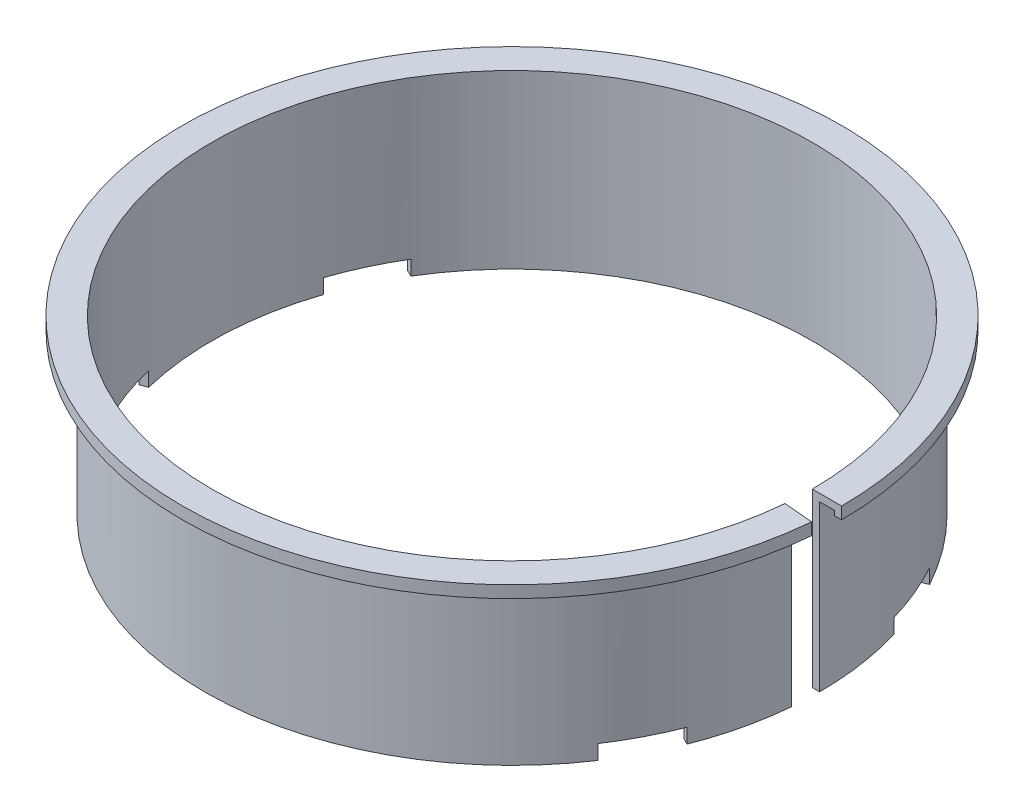
ISO-10303-21;
HEADER;
FILE_DESCRIPTION(('STEP AP214'),'2;1');
FILE_NAME('part.step','',(''),(''),'','','');
FILE_SCHEMA(('AUTOMOTIVE_DESIGN { 1 0 10303 214 1 1 1 1 }'));
ENDSEC;
DATA;
#1=APPLICATION_CONTEXT('core data for automotive mechanical design processes');
#2=APPLICATION_PROTOCOL_DEFINITION('international standard','automotive_design',2000,#1);
#3=PRODUCT_CONTEXT('',#1,'mechanical');
#4=PRODUCT('Part','Part','',(#3));
#5=PRODUCT_RELATED_PRODUCT_CATEGORY('part','',(#4));
#6=PRODUCT_DEFINITION_FORMATION('','',#4);
#7=PRODUCT_DEFINITION_CONTEXT('part definition',#1,'design');
#8=PRODUCT_DEFINITION('design','',#6,#7);
#9=PRODUCT_DEFINITION_SHAPE('','',#8);
#10=(LENGTH_UNIT() NAMED_UNIT(*) SI_UNIT(.MILLI.,.METRE.));
#11=(NAMED_UNIT(*) PLANE_ANGLE_UNIT() SI_UNIT($,.RADIAN.));
#12=(NAMED_UNIT(*) SI_UNIT($,.STERADIAN.) SOLID_ANGLE_UNIT());
#13=UNCERTAINTY_MEASURE_WITH_UNIT(LENGTH_MEASURE(1.E-05),#10,'distance_accuracy_value','');
#14=(GEOMETRIC_REPRESENTATION_CONTEXT(3) GLOBAL_UNCERTAINTY_ASSIGNED_CONTEXT((#13)) GLOBAL_UNIT_ASSIGNED_CONTEXT((#10,
#11,#12)) REPRESENTATION_CONTEXT('',''));
#15=CARTESIAN_POINT('',(0.,0.,0.));
#16=DIRECTION('',(0.,0.,1.));
#17=DIRECTION('',(1.,0.,0.));
#18=AXIS2_PLACEMENT_3D('',#15,#16,#17);
#19=CARTESIAN_POINT('',(0.,27.5,0.));
#20=DIRECTION('',(0.,-1.,0.));
#21=DIRECTION('',(0.,0.,-1.));
#22=AXIS2_PLACEMENT_3D('',#19,#20,#21);
#23=PLANE('',#22);
#24=DIRECTION('',(1.,0.,0.));
#25=VECTOR('',#24,1.);
#26=CARTESIAN_POINT('',(0.,27.5,0.));
#27=LINE('',#26,#25);
#28=CARTESIAN_POINT('',(102.5,27.5,0.));
#29=VERTEX_POINT('',#28);
#30=CARTESIAN_POINT('',(105.,27.5,0.));
#31=VERTEX_POINT('',#30);
#32=EDGE_CURVE('E322',#29,#31,#27,.T.);
#33=ORIENTED_EDGE('',*,*,#32,.F.);
#34=CARTESIAN_POINT('',(0.,27.5,0.));
#35=DIRECTION('',(0.,-1.,0.));
#36=DIRECTION('',(0.,0.,-1.));
#37=AXIS2_PLACEMENT_3D('',#34,#35,#36);
#38=CIRCLE('',#37,102.5);
#39=CARTESIAN_POINT('',(98.3719399413447,27.5,-28.7960315352042));
#40=VERTEX_POINT('',#39);
#41=EDGE_CURVE('E329',#29,#40,#38,.F.);
#42=ORIENTED_EDGE('',*,*,#41,.T.);
#43=DIRECTION('',(-0.923093568144189,0.,0.384575434018905));
#44=VECTOR('',#43,1.);
#45=CARTESIAN_POINT('',(89.261262530645,27.5,-25.0003786996309));
#46=LINE('',#45,#44);
#47=CARTESIAN_POINT('',(100.693363737791,27.5,-29.7631735399469));
#48=VERTEX_POINT('',#47);
#49=EDGE_CURVE('E318',#48,#40,#46,.T.);
#50=ORIENTED_EDGE('',*,*,#49,.F.);
#51=CARTESIAN_POINT('',(0.,27.5,0.));
#52=DIRECTION('',(0.,-1.,0.));
#53=DIRECTION('',(0.,0.,-1.));
#54=AXIS2_PLACEMENT_3D('',#51,#52,#53);
#55=CIRCLE('',#54,105.);
#56=EDGE_CURVE('E352',#31,#48,#55,.F.);
#57=ORIENTED_EDGE('',*,*,#56,.F.);
#58=EDGE_LOOP('',(#33,#42,#50,#57));
#59=FACE_BOUND('',#58,.T.);
#60=ADVANCED_FACE('F42',(#59),#23,.T.);
#61=CARTESIAN_POINT('',(89.7189926759193,27.5,-49.5656368184485));
#62=VERTEX_POINT('',#61);
#63=CARTESIAN_POINT('',(-87.6470877946232,27.5,-53.1435602977596));
#64=VERTEX_POINT('',#63);
#65=EDGE_CURVE('E326',#62,#64,#38,.F.);
#66=ORIENTED_EDGE('',*,*,#65,.T.);
#67=DIRECTION('',(-0.906833191041583,0.,-0.421489695752269));
#68=VECTOR('',#67,1.);
#69=CARTESIAN_POINT('',(-78.6968957945803,27.5,-48.9835739405228));
#70=LINE('',#69,#68);
#71=CARTESIAN_POINT('',(-89.9276194999011,27.5,-54.2035354112719));
#72=VERTEX_POINT('',#71);
#73=EDGE_CURVE('E330',#64,#72,#70,.T.);
#74=ORIENTED_EDGE('',*,*,#73,.T.);
#75=CARTESIAN_POINT('',(92.0404164723653,27.5,-50.5327788231911));
#76=VERTEX_POINT('',#75);
#77=EDGE_CURVE('E323',#76,#72,#55,.F.);
#78=ORIENTED_EDGE('',*,*,#77,.F.);
#79=DIRECTION('',(-0.923093568144189,0.,0.384575434018905));
#80=VECTOR('',#79,1.);
#81=CARTESIAN_POINT('',(80.6083152652197,27.5,-45.7699839828751));
#82=LINE('',#81,#80);
#83=EDGE_CURVE('E333',#76,#62,#82,.T.);
#84=ORIENTED_EDGE('',*,*,#83,.T.);
#85=EDGE_LOOP('',(#66,#74,#78,#84));
#86=FACE_BOUND('',#85,.T.);
#87=ADVANCED_FACE('F365',(#86),#23,.T.);
#88=CARTESIAN_POINT('',(95.6100685272702,27.5,36.9454299773421));
#89=VERTEX_POINT('',#88);
#90=CARTESIAN_POINT('',(102.109956554404,27.5,8.93346363163362));
#91=VERTEX_POINT('',#90);
#92=EDGE_CURVE('E343',#89,#91,#38,.F.);
#93=ORIENTED_EDGE('',*,*,#92,.T.);
#94=DIRECTION('',(0.996194698091747,0.,0.087155742747645));
#95=VECTOR('',#94,1.);
#96=CARTESIAN_POINT('',(0.,27.5,0.));
#97=LINE('',#96,#95);
#98=CARTESIAN_POINT('',(104.600443299633,27.5,9.15135298850273));
#99=VERTEX_POINT('',#98);
#100=EDGE_CURVE('E227',#91,#99,#97,.T.);
#101=ORIENTED_EDGE('',*,*,#100,.T.);
#102=CARTESIAN_POINT('',(97.8421942066153,27.5,38.103871625269));
#103=VERTEX_POINT('',#102);
#104=EDGE_CURVE('E220',#103,#99,#55,.F.);
#105=ORIENTED_EDGE('',*,*,#104,.F.);
#106=DIRECTION('',(0.887584964471982,0.,0.460644039192163));
#107=VECTOR('',#106,1.);
#108=CARTESIAN_POINT('',(86.849851183162,27.5,32.399001113496));
#109=LINE('',#108,#107);
#110=EDGE_CURVE('E316',#89,#103,#109,.T.);
#111=ORIENTED_EDGE('',*,*,#110,.F.);
#112=EDGE_LOOP('',(#93,#101,#105,#111));
#113=FACE_BOUND('',#112,.T.);
#114=ADVANCED_FACE('F340',(#113),#23,.T.);
#115=DIRECTION('',(-0.906833191041583,0.,-0.421489695752269));
#116=VECTOR('',#115,1.);
#117=CARTESIAN_POINT('',(-88.1804139490064,27.5,-28.5798271420872));
#118=LINE('',#117,#116);
#119=CARTESIAN_POINT('',(-97.1306059490493,27.5,-32.739813499324));
#120=VERTEX_POINT('',#119);
#121=CARTESIAN_POINT('',(-99.4111376543272,27.5,-33.7997886128363));
#122=VERTEX_POINT('',#121);
#123=EDGE_CURVE('E320',#120,#122,#118,.T.);
#124=ORIENTED_EDGE('',*,*,#123,.F.);
#125=CARTESIAN_POINT('',(-99.5343769060761,27.5,24.4777003396805));
#126=VERTEX_POINT('',#125);
#127=EDGE_CURVE('E325',#120,#126,#38,.F.);
#128=ORIENTED_EDGE('',*,*,#127,.T.);
#129=DIRECTION('',(0.938989932435764,0.,-0.343944627497333));
#130=VECTOR('',#129,1.);
#131=CARTESIAN_POINT('',(-90.2668067901714,27.5,21.0830622916966));
#132=LINE('',#131,#130);
#133=CARTESIAN_POINT('',(-101.895777363195,27.5,25.3426627557195));
#134=VERTEX_POINT('',#133);
#135=EDGE_CURVE('E234',#134,#126,#132,.T.);
#136=ORIENTED_EDGE('',*,*,#135,.F.);
#137=EDGE_CURVE('E221',#122,#134,#55,.F.);
#138=ORIENTED_EDGE('',*,*,#137,.F.);
#139=EDGE_LOOP('',(#124,#128,#136,#138));
#140=FACE_BOUND('',#139,.T.);
#141=ADVANCED_FACE('F474',(#140),#23,.T.);
#142=CARTESIAN_POINT('',(-91.7956227873861,27.5,45.6049738194851));
#143=VERTEX_POINT('',#142);
#144=CARTESIAN_POINT('',(85.2455776454466,27.5,56.9160916779617));
#145=VERTEX_POINT('',#144);
#146=EDGE_CURVE('E399',#143,#145,#38,.F.);
#147=ORIENTED_EDGE('',*,*,#146,.T.);
#148=DIRECTION('',(0.887584964471982,0.,0.460644039192163));
#149=VECTOR('',#148,1.);
#150=CARTESIAN_POINT('',(76.4853603013383,27.5,52.3696628141156));
#151=LINE('',#150,#149);
#152=CARTESIAN_POINT('',(87.4777033247916,27.5,58.0745333258886));
#153=VERTEX_POINT('',#152);
#154=EDGE_CURVE('E219',#145,#153,#151,.T.);
#155=ORIENTED_EDGE('',*,*,#154,.T.);
#156=CARTESIAN_POINT('',(-94.1570232445054,27.5,46.4699362355241));
#157=VERTEX_POINT('',#156);
#158=EDGE_CURVE('E209',#157,#153,#55,.F.);
#159=ORIENTED_EDGE('',*,*,#158,.F.);
#160=DIRECTION('',(0.938989932435764,0.,-0.343944627497333));
#161=VECTOR('',#160,1.);
#162=CARTESIAN_POINT('',(-82.5280526714814,27.5,42.2103357715013));
#163=LINE('',#162,#161);
#164=EDGE_CURVE('E217',#157,#143,#163,.T.);
#165=ORIENTED_EDGE('',*,*,#164,.T.);
#166=EDGE_LOOP('',(#147,#155,#159,#165));
#167=FACE_BOUND('',#166,.T.);
#168=ADVANCED_FACE('F216',(#167),#23,.T.);
#169=CARTESIAN_POINT('',(0.,82.2536172695449,0.));
#170=DIRECTION('',(0.,-1.,0.));
#171=DIRECTION('',(0.,0.,-1.));
#172=AXIS2_PLACEMENT_3D('',#169,#170,#171);
#173=CYLINDRICAL_SURFACE('',#172,105.);
#174=DIRECTION('',(0.,-1.,0.));
#175=VECTOR('',#174,1.);
#176=CARTESIAN_POINT('',(-99.4111376543272,82.2536172695449,-33.7997886128363));
#177=LINE('',#176,#175);
#178=CARTESIAN_POINT('',(-99.4111376543272,32.5,-33.7997886128363));
#179=VERTEX_POINT('',#178);
#180=EDGE_CURVE('E261',#179,#122,#177,.T.);
#181=ORIENTED_EDGE('',*,*,#180,.T.);
#182=ORIENTED_EDGE('',*,*,#137,.T.);
#183=DIRECTION('',(0.,-1.,0.));
#184=VECTOR('',#183,1.);
#185=CARTESIAN_POINT('',(-101.895777363195,82.2536172695449,25.3426627557195));
#186=LINE('',#185,#184);
#187=CARTESIAN_POINT('',(-101.895777363195,32.5,25.3426627557195));
#188=VERTEX_POINT('',#187);
#189=EDGE_CURVE('E300',#134,#188,#186,.F.);
#190=ORIENTED_EDGE('',*,*,#189,.T.);
#191=CARTESIAN_POINT('',(0.,32.5,0.));
#192=DIRECTION('',(0.,1.,0.));
#193=DIRECTION('',(0.0436193873653294,0.,-0.999048221581858));
#194=AXIS2_PLACEMENT_3D('',#191,#192,#193);
#195=CIRCLE('',#194,105.);
#196=CARTESIAN_POINT('',(-94.1570232445054,32.5,46.4699362355241));
#197=VERTEX_POINT('',#196);
#198=EDGE_CURVE('E212',#197,#188,#195,.F.);
#199=ORIENTED_EDGE('',*,*,#198,.F.);
#200=DIRECTION('',(0.,-1.,0.));
#201=VECTOR('',#200,1.);
#202=CARTESIAN_POINT('',(-94.1570232445054,82.2536172695449,46.4699362355241));
#203=LINE('',#202,#201);
#204=EDGE_CURVE('E46',#157,#197,#203,.F.);
#205=ORIENTED_EDGE('',*,*,#204,.F.);
#206=ORIENTED_EDGE('',*,*,#158,.T.);
#207=DIRECTION('',(0.,-1.,0.));
#208=VECTOR('',#207,1.);
#209=CARTESIAN_POINT('',(87.4777033247916,82.2536172695449,58.0745333258886));
#210=LINE('',#209,#208);
#211=CARTESIAN_POINT('',(87.4777033247916,32.5,58.0745333258886));
#212=VERTEX_POINT('',#211);
#213=EDGE_CURVE('E290',#212,#153,#210,.T.);
#214=ORIENTED_EDGE('',*,*,#213,.F.);
#215=CARTESIAN_POINT('',(0.,32.5,0.));
#216=DIRECTION('',(0.,1.,0.));
#217=DIRECTION('',(0.0436193873653294,0.,-0.999048221581858));
#218=AXIS2_PLACEMENT_3D('',#215,#216,#217);
#219=CIRCLE('',#218,105.);
#220=CARTESIAN_POINT('',(97.8421942066153,32.5,38.103871625269));
#221=VERTEX_POINT('',#220);
#222=EDGE_CURVE('E296',#221,#212,#219,.F.);
#223=ORIENTED_EDGE('',*,*,#222,.F.);
#224=DIRECTION('',(0.,-1.,0.));
#225=VECTOR('',#224,1.);
#226=CARTESIAN_POINT('',(97.8421942066153,82.2536172695449,38.103871625269));
#227=LINE('',#226,#225);
#228=EDGE_CURVE('E297',#221,#103,#227,.T.);
#229=ORIENTED_EDGE('',*,*,#228,.T.);
#230=ORIENTED_EDGE('',*,*,#104,.T.);
#231=DIRECTION('',(0.,1.,0.));
#232=VECTOR('',#231,1.);
#233=CARTESIAN_POINT('',(104.600443299633,0.,9.15135298850273));
#234=LINE('',#233,#232);
#235=CARTESIAN_POINT('',(104.600443299633,83.7,9.15135298850273));
#236=VERTEX_POINT('',#235);
#237=EDGE_CURVE('E288',#99,#236,#234,.T.);
#238=ORIENTED_EDGE('',*,*,#237,.T.);
#239=CARTESIAN_POINT('',(0.,83.7,0.));
#240=DIRECTION('',(0.,-1.,0.));
#241=DIRECTION('',(0.,0.,-1.));
#242=AXIS2_PLACEMENT_3D('',#239,#240,#241);
#243=CIRCLE('',#242,105.);
#244=CARTESIAN_POINT('',(105.,83.7,0.));
#245=VERTEX_POINT('',#244);
#246=EDGE_CURVE('E243',#236,#245,#243,.T.);
#247=ORIENTED_EDGE('',*,*,#246,.T.);
#248=DIRECTION('',(0.,1.,0.));
#249=VECTOR('',#248,1.);
#250=CARTESIAN_POINT('',(105.,0.,0.));
#251=LINE('',#250,#249);
#252=EDGE_CURVE('E252',#31,#245,#251,.T.);
#253=ORIENTED_EDGE('',*,*,#252,.F.);
#254=ORIENTED_EDGE('',*,*,#56,.T.);
#255=DIRECTION('',(0.,-1.,0.));
#256=VECTOR('',#255,1.);
#257=CARTESIAN_POINT('',(100.693363737791,82.2536172695449,-29.7631735399469));
#258=LINE('',#257,#256);
#259=CARTESIAN_POINT('',(100.693363737791,32.5,-29.7631735399469));
#260=VERTEX_POINT('',#259);
#261=EDGE_CURVE('E264',#48,#260,#258,.F.);
#262=ORIENTED_EDGE('',*,*,#261,.T.);
#263=CARTESIAN_POINT('',(0.,32.5,0.));
#264=DIRECTION('',(0.,1.,0.));
#265=DIRECTION('',(0.,0.,1.));
#266=AXIS2_PLACEMENT_3D('',#263,#264,#265);
#267=CIRCLE('',#266,105.);
#268=CARTESIAN_POINT('',(92.0404164723653,32.5,-50.5327788231911));
#269=VERTEX_POINT('',#268);
#270=EDGE_CURVE('E266',#269,#260,#267,.F.);
#271=ORIENTED_EDGE('',*,*,#270,.F.);
#272=DIRECTION('',(0.,-1.,0.));
#273=VECTOR('',#272,1.);
#274=CARTESIAN_POINT('',(92.0404164723653,82.2536172695449,-50.5327788231911));
#275=LINE('',#274,#273);
#276=EDGE_CURVE('E268',#76,#269,#275,.F.);
#277=ORIENTED_EDGE('',*,*,#276,.F.);
#278=ORIENTED_EDGE('',*,*,#77,.T.);
#279=DIRECTION('',(0.,-1.,0.));
#280=VECTOR('',#279,1.);
#281=CARTESIAN_POINT('',(-89.9276194999011,82.2536172695449,-54.2035354112719));
#282=LINE('',#281,#280);
#283=CARTESIAN_POINT('',(-89.9276194999011,32.5,-54.2035354112719));
#284=VERTEX_POINT('',#283);
#285=EDGE_CURVE('E254',#284,#72,#282,.T.);
#286=ORIENTED_EDGE('',*,*,#285,.F.);
#287=CARTESIAN_POINT('',(0.,32.5,0.));
#288=DIRECTION('',(0.,1.,0.));
#289=DIRECTION('',(0.,0.,1.));
#290=AXIS2_PLACEMENT_3D('',#287,#288,#289);
#291=CIRCLE('',#290,105.);
#292=EDGE_CURVE('E260',#179,#284,#291,.F.);
#293=ORIENTED_EDGE('',*,*,#292,.F.);
#294=EDGE_LOOP('',(#181,#182,#190,#199,#205,#206,#214,#223,#229,#230,#238,#247,#253,#254,#262,
#271,#277,#278,#286,#293));
#295=FACE_BOUND('',#294,.T.);
#296=ADVANCED_FACE('F207',(#295),#173,.T.);
#297=CARTESIAN_POINT('',(0.,82.2536172695449,0.));
#298=DIRECTION('',(0.,-1.,0.));
#299=DIRECTION('',(0.,0.,-1.));
#300=AXIS2_PLACEMENT_3D('',#297,#298,#299);
#301=CYLINDRICAL_SURFACE('',#300,102.5);
#302=ORIENTED_EDGE('',*,*,#127,.F.);
#303=DIRECTION('',(0.,-1.,0.));
#304=VECTOR('',#303,1.);
#305=CARTESIAN_POINT('',(-97.1306059490493,82.2536172695449,-32.739813499324));
#306=LINE('',#305,#304);
#307=CARTESIAN_POINT('',(-97.1306059490492,32.5,-32.739813499324));
#308=VERTEX_POINT('',#307);
#309=EDGE_CURVE('E240',#308,#120,#306,.T.);
#310=ORIENTED_EDGE('',*,*,#309,.F.);
#311=CARTESIAN_POINT('',(0.,32.5,0.));
#312=DIRECTION('',(0.,1.,0.));
#313=DIRECTION('',(0.,0.,1.));
#314=AXIS2_PLACEMENT_3D('',#311,#312,#313);
#315=CIRCLE('',#314,102.5);
#316=CARTESIAN_POINT('',(-87.6470877946232,32.5,-53.1435602977596));
#317=VERTEX_POINT('',#316);
#318=EDGE_CURVE('E239',#308,#317,#315,.F.);
#319=ORIENTED_EDGE('',*,*,#318,.T.);
#320=DIRECTION('',(0.,-1.,0.));
#321=VECTOR('',#320,1.);
#322=CARTESIAN_POINT('',(-87.6470877946232,82.2536172695449,-53.1435602977596));
#323=LINE('',#322,#321);
#324=EDGE_CURVE('E237',#317,#64,#323,.T.);
#325=ORIENTED_EDGE('',*,*,#324,.T.);
#326=ORIENTED_EDGE('',*,*,#65,.F.);
#327=DIRECTION('',(0.,-1.,0.));
#328=VECTOR('',#327,1.);
#329=CARTESIAN_POINT('',(89.7189926759193,82.2536172695449,-49.5656368184485));
#330=LINE('',#329,#328);
#331=CARTESIAN_POINT('',(89.7189926759193,32.5,-49.5656368184485));
#332=VERTEX_POINT('',#331);
#333=EDGE_CURVE('E235',#62,#332,#330,.F.);
#334=ORIENTED_EDGE('',*,*,#333,.T.);
#335=CARTESIAN_POINT('',(0.,32.5,0.));
#336=DIRECTION('',(0.,1.,0.));
#337=DIRECTION('',(0.,0.,1.));
#338=AXIS2_PLACEMENT_3D('',#335,#336,#337);
#339=CIRCLE('',#338,102.5);
#340=CARTESIAN_POINT('',(98.3719399413447,32.5,-28.7960315352042));
#341=VERTEX_POINT('',#340);
#342=EDGE_CURVE('E233',#332,#341,#339,.F.);
#343=ORIENTED_EDGE('',*,*,#342,.T.);
#344=DIRECTION('',(0.,-1.,0.));
#345=VECTOR('',#344,1.);
#346=CARTESIAN_POINT('',(98.3719399413447,82.2536172695449,-28.7960315352042));
#347=LINE('',#346,#345);
#348=EDGE_CURVE('E231',#40,#341,#347,.F.);
#349=ORIENTED_EDGE('',*,*,#348,.F.);
#350=ORIENTED_EDGE('',*,*,#41,.F.);
#351=DIRECTION('',(0.,1.,0.));
#352=VECTOR('',#351,1.);
#353=CARTESIAN_POINT('',(102.5,0.,0.));
#354=LINE('',#353,#352);
#355=CARTESIAN_POINT('',(102.5,86.2,0.));
#356=VERTEX_POINT('',#355);
#357=EDGE_CURVE('E249',#29,#356,#354,.T.);
#358=ORIENTED_EDGE('',*,*,#357,.T.);
#359=CARTESIAN_POINT('',(0.,86.2,0.));
#360=DIRECTION('',(0.,-1.,0.));
#361=DIRECTION('',(0.,0.,-1.));
#362=AXIS2_PLACEMENT_3D('',#359,#360,#361);
#363=CIRCLE('',#362,102.5);
#364=CARTESIAN_POINT('',(102.109956554404,86.2,8.93346363163362));
#365=VERTEX_POINT('',#364);
#366=EDGE_CURVE('E251',#365,#356,#363,.T.);
#367=ORIENTED_EDGE('',*,*,#366,.F.);
#368=DIRECTION('',(0.,1.,0.));
#369=VECTOR('',#368,1.);
#370=CARTESIAN_POINT('',(102.109956554404,0.,8.93346363163362));
#371=LINE('',#370,#369);
#372=EDGE_CURVE('E281',#91,#365,#371,.T.);
#373=ORIENTED_EDGE('',*,*,#372,.F.);
#374=ORIENTED_EDGE('',*,*,#92,.F.);
#375=DIRECTION('',(0.,-1.,0.));
#376=VECTOR('',#375,1.);
#377=CARTESIAN_POINT('',(95.6100685272702,82.2536172695449,36.9454299773421));
#378=LINE('',#377,#376);
#379=CARTESIAN_POINT('',(95.6100685272702,32.5,36.9454299773421));
#380=VERTEX_POINT('',#379);
#381=EDGE_CURVE('E278',#380,#89,#378,.T.);
#382=ORIENTED_EDGE('',*,*,#381,.F.);
#383=CARTESIAN_POINT('',(0.,32.5,0.));
#384=DIRECTION('',(0.,1.,0.));
#385=DIRECTION('',(0.0436193873653294,0.,-0.999048221581858));
#386=AXIS2_PLACEMENT_3D('',#383,#384,#385);
#387=CIRCLE('',#386,102.5);
#388=CARTESIAN_POINT('',(85.2455776454466,32.5,56.9160916779617));
#389=VERTEX_POINT('',#388);
#390=EDGE_CURVE('E277',#380,#389,#387,.F.);
#391=ORIENTED_EDGE('',*,*,#390,.T.);
#392=DIRECTION('',(0.,-1.,0.));
#393=VECTOR('',#392,1.);
#394=CARTESIAN_POINT('',(85.2455776454466,82.2536172695449,56.9160916779617));
#395=LINE('',#394,#393);
#396=EDGE_CURVE('E275',#389,#145,#395,.T.);
#397=ORIENTED_EDGE('',*,*,#396,.T.);
#398=ORIENTED_EDGE('',*,*,#146,.F.);
#399=DIRECTION('',(0.,-1.,0.));
#400=VECTOR('',#399,1.);
#401=CARTESIAN_POINT('',(-91.7956227873861,82.2536172695449,45.6049738194851));
#402=LINE('',#401,#400);
#403=CARTESIAN_POINT('',(-91.7956227873861,32.5,45.6049738194851));
#404=VERTEX_POINT('',#403);
#405=EDGE_CURVE('E224',#143,#404,#402,.F.);
#406=ORIENTED_EDGE('',*,*,#405,.T.);
#407=CARTESIAN_POINT('',(0.,32.5,0.));
#408=DIRECTION('',(0.,1.,0.));
#409=DIRECTION('',(0.0436193873653294,0.,-0.999048221581858));
#410=AXIS2_PLACEMENT_3D('',#407,#408,#409);
#411=CIRCLE('',#410,102.5);
#412=CARTESIAN_POINT('',(-99.5343769060761,32.5,24.4777003396805));
#413=VERTEX_POINT('',#412);
#414=EDGE_CURVE('E272',#404,#413,#411,.F.);
#415=ORIENTED_EDGE('',*,*,#414,.T.);
#416=DIRECTION('',(0.,-1.,0.));
#417=VECTOR('',#416,1.);
#418=CARTESIAN_POINT('',(-99.5343769060761,82.2536172695449,24.4777003396805));
#419=LINE('',#418,#417);
#420=EDGE_CURVE('E65',#126,#413,#419,.F.);
#421=ORIENTED_EDGE('',*,*,#420,.F.);
#422=EDGE_LOOP('',(#302,#310,#319,#325,#326,#334,#343,#349,#350,#358,#367,#373,#374,#382,#391,
#397,#398,#406,#415,#421));
#423=FACE_BOUND('',#422,.T.);
#424=ADVANCED_FACE('F398',(#423),#301,.F.);
#425=CARTESIAN_POINT('',(0.,0.,0.));
#426=DIRECTION('',(0.,0.,1.));
#427=DIRECTION('',(1.,0.,0.));
#428=AXIS2_PLACEMENT_3D('',#425,#426,#427);
#429=PLANE('',#428);
#430=ORIENTED_EDGE('',*,*,#357,.F.);
#431=ORIENTED_EDGE('',*,*,#32,.T.);
#432=ORIENTED_EDGE('',*,*,#252,.T.);
#433=DIRECTION('',(1.,0.,0.));
#434=VECTOR('',#433,1.);
#435=CARTESIAN_POINT('',(0.,83.7,0.));
#436=LINE('',#435,#434);
#437=CARTESIAN_POINT('',(110.,83.7,0.));
#438=VERTEX_POINT('',#437);
#439=EDGE_CURVE('E255',#245,#438,#436,.T.);
#440=ORIENTED_EDGE('',*,*,#439,.T.);
#441=DIRECTION('',(0.,1.,0.));
#442=VECTOR('',#441,1.);
#443=CARTESIAN_POINT('',(110.,0.,0.));
#444=LINE('',#443,#442);
#445=CARTESIAN_POINT('',(110.,82.1,0.));
#446=VERTEX_POINT('',#445);
#447=EDGE_CURVE('E256',#446,#438,#444,.T.);
#448=ORIENTED_EDGE('',*,*,#447,.F.);
#449=DIRECTION('',(1.,0.,0.));
#450=VECTOR('',#449,1.);
#451=CARTESIAN_POINT('',(0.,82.1,0.));
#452=LINE('',#451,#450);
#453=CARTESIAN_POINT('',(112.5,82.1,0.));
#454=VERTEX_POINT('',#453);
#455=EDGE_CURVE('E247',#446,#454,#452,.T.);
#456=ORIENTED_EDGE('',*,*,#455,.T.);
#457=DIRECTION('',(0.,1.,0.));
#458=VECTOR('',#457,1.);
#459=CARTESIAN_POINT('',(112.5,0.,0.));
#460=LINE('',#459,#458);
#461=CARTESIAN_POINT('',(112.5,86.2,0.));
#462=VERTEX_POINT('',#461);
#463=EDGE_CURVE('E244',#454,#462,#460,.T.);
#464=ORIENTED_EDGE('',*,*,#463,.T.);
#465=DIRECTION('',(1.,0.,0.));
#466=VECTOR('',#465,1.);
#467=CARTESIAN_POINT('',(0.,86.2,0.));
#468=LINE('',#467,#466);
#469=EDGE_CURVE('E248',#356,#462,#468,.T.);
#470=ORIENTED_EDGE('',*,*,#469,.F.);
#471=EDGE_LOOP('',(#430,#431,#432,#440,#448,#456,#464,#470));
#472=FACE_BOUND('',#471,.T.);
#473=ADVANCED_FACE('F44',(#472),#429,.T.);
#474=CARTESIAN_POINT('',(-78.6968957945803,0.,-48.9835739405228));
#475=DIRECTION('',(0.421489695752269,0.,-0.906833191041583));
#476=DIRECTION('',(-0.906833191041583,0.,-0.421489695752269));
#477=AXIS2_PLACEMENT_3D('',#474,#475,#476);
#478=PLANE('',#477);
#479=ORIENTED_EDGE('',*,*,#73,.F.);
#480=ORIENTED_EDGE('',*,*,#324,.F.);
#481=DIRECTION('',(-0.906833191041583,0.,-0.421489695752269));
#482=VECTOR('',#481,1.);
#483=CARTESIAN_POINT('',(-78.6968957945803,32.5,-48.9835739405228));
#484=LINE('',#483,#482);
#485=EDGE_CURVE('E263',#317,#284,#484,.T.);
#486=ORIENTED_EDGE('',*,*,#485,.T.);
#487=ORIENTED_EDGE('',*,*,#285,.T.);
#488=EDGE_LOOP('',(#479,#480,#486,#487));
#489=FACE_BOUND('',#488,.T.);
#490=ADVANCED_FACE('F368',(#489),#478,.F.);
#491=CARTESIAN_POINT('',(-88.1804139490064,0.,-28.5798271420872));
#492=DIRECTION('',(0.421489695752269,0.,-0.906833191041583));
#493=DIRECTION('',(-0.906833191041583,0.,-0.421489695752269));
#494=AXIS2_PLACEMENT_3D('',#491,#492,#493);
#495=PLANE('',#494);
#496=ORIENTED_EDGE('',*,*,#309,.T.);
#497=ORIENTED_EDGE('',*,*,#123,.T.);
#498=ORIENTED_EDGE('',*,*,#180,.F.);
#499=DIRECTION('',(-0.906833191041583,0.,-0.421489695752269));
#500=VECTOR('',#499,1.);
#501=CARTESIAN_POINT('',(-88.1804139490063,32.5,-28.5798271420872));
#502=LINE('',#501,#500);
#503=EDGE_CURVE('E267',#308,#179,#502,.T.);
#504=ORIENTED_EDGE('',*,*,#503,.F.);
#505=EDGE_LOOP('',(#496,#497,#498,#504));
#506=FACE_BOUND('',#505,.T.);
#507=ADVANCED_FACE('F639',(#506),#495,.T.);
#508=CARTESIAN_POINT('',(89.261262530645,0.,-25.0003786996309));
#509=DIRECTION('',(-0.384575434018905,0.,-0.923093568144189));
#510=DIRECTION('',(-0.923093568144189,0.,0.384575434018905));
#511=AXIS2_PLACEMENT_3D('',#508,#509,#510);
#512=PLANE('',#511);
#513=ORIENTED_EDGE('',*,*,#261,.F.);
#514=ORIENTED_EDGE('',*,*,#49,.T.);
#515=ORIENTED_EDGE('',*,*,#348,.T.);
#516=DIRECTION('',(0.923093568144189,0.,-0.384575434018905));
#517=VECTOR('',#516,1.);
#518=CARTESIAN_POINT('',(89.261262530645,32.5,-25.0003786996309));
#519=LINE('',#518,#517);
#520=EDGE_CURVE('E270',#341,#260,#519,.T.);
#521=ORIENTED_EDGE('',*,*,#520,.T.);
#522=EDGE_LOOP('',(#513,#514,#515,#521));
#523=FACE_BOUND('',#522,.T.);
#524=ADVANCED_FACE('F411',(#523),#512,.T.);
#525=CARTESIAN_POINT('',(80.6083152652197,0.,-45.7699839828751));
#526=DIRECTION('',(-0.384575434018905,0.,-0.923093568144189));
#527=DIRECTION('',(-0.923093568144189,0.,0.384575434018905));
#528=AXIS2_PLACEMENT_3D('',#525,#526,#527);
#529=PLANE('',#528);
#530=ORIENTED_EDGE('',*,*,#83,.F.);
#531=ORIENTED_EDGE('',*,*,#276,.T.);
#532=DIRECTION('',(0.923093568144189,0.,-0.384575434018905));
#533=VECTOR('',#532,1.);
#534=CARTESIAN_POINT('',(80.6083152652197,32.5,-45.7699839828751));
#535=LINE('',#534,#533);
#536=EDGE_CURVE('E273',#332,#269,#535,.T.);
#537=ORIENTED_EDGE('',*,*,#536,.F.);
#538=ORIENTED_EDGE('',*,*,#333,.F.);
#539=EDGE_LOOP('',(#530,#531,#537,#538));
#540=FACE_BOUND('',#539,.T.);
#541=ADVANCED_FACE('F416',(#540),#529,.F.);
#542=CARTESIAN_POINT('',(0.,0.,0.));
#543=DIRECTION('',(-0.087155742747645,0.,0.996194698091747));
#544=DIRECTION('',(0.996194698091747,0.,0.087155742747645));
#545=AXIS2_PLACEMENT_3D('',#542,#543,#544);
#546=PLANE('',#545);
#547=ORIENTED_EDGE('',*,*,#100,.F.);
#548=ORIENTED_EDGE('',*,*,#372,.T.);
#549=DIRECTION('',(0.996194698091747,0.,0.087155742747645));
#550=VECTOR('',#549,1.);
#551=CARTESIAN_POINT('',(0.,86.2,0.));
#552=LINE('',#551,#550);
#553=CARTESIAN_POINT('',(112.071903535321,86.2,9.80502105911007));
#554=VERTEX_POINT('',#553);
#555=EDGE_CURVE('E286',#365,#554,#552,.T.);
#556=ORIENTED_EDGE('',*,*,#555,.T.);
#557=DIRECTION('',(0.,1.,0.));
#558=VECTOR('',#557,1.);
#559=CARTESIAN_POINT('',(112.071903535321,0.,9.80502105911007));
#560=LINE('',#559,#558);
#561=CARTESIAN_POINT('',(112.071903535321,82.1,9.80502105911007));
#562=VERTEX_POINT('',#561);
#563=EDGE_CURVE('E282',#562,#554,#560,.T.);
#564=ORIENTED_EDGE('',*,*,#563,.F.);
#565=DIRECTION('',(0.996194698091747,0.,0.087155742747645));
#566=VECTOR('',#565,1.);
#567=CARTESIAN_POINT('',(0.,82.1,0.));
#568=LINE('',#567,#566);
#569=CARTESIAN_POINT('',(109.581416790092,82.1,9.58713170224095));
#570=VERTEX_POINT('',#569);
#571=EDGE_CURVE('E285',#570,#562,#568,.T.);
#572=ORIENTED_EDGE('',*,*,#571,.F.);
#573=DIRECTION('',(0.,1.,0.));
#574=VECTOR('',#573,1.);
#575=CARTESIAN_POINT('',(109.581416790092,0.,9.58713170224095));
#576=LINE('',#575,#574);
#577=CARTESIAN_POINT('',(109.581416790092,83.7,9.58713170224095));
#578=VERTEX_POINT('',#577);
#579=EDGE_CURVE('E292',#570,#578,#576,.T.);
#580=ORIENTED_EDGE('',*,*,#579,.T.);
#581=DIRECTION('',(0.996194698091747,0.,0.087155742747645));
#582=VECTOR('',#581,1.);
#583=CARTESIAN_POINT('',(0.,83.7,0.));
#584=LINE('',#583,#582);
#585=EDGE_CURVE('E291',#236,#578,#584,.T.);
#586=ORIENTED_EDGE('',*,*,#585,.F.);
#587=ORIENTED_EDGE('',*,*,#237,.F.);
#588=EDGE_LOOP('',(#547,#548,#556,#564,#572,#580,#586,#587));
#589=FACE_BOUND('',#588,.T.);
#590=ADVANCED_FACE('F345',(#589),#546,.F.);
#591=CARTESIAN_POINT('',(76.4853603013383,0.,52.3696628141156));
#592=DIRECTION('',(-0.460644039192163,0.,0.887584964471982));
#593=DIRECTION('',(0.887584964471982,0.,0.460644039192163));
#594=AXIS2_PLACEMENT_3D('',#591,#592,#593);
#595=PLANE('',#594);
#596=ORIENTED_EDGE('',*,*,#154,.F.);
#597=ORIENTED_EDGE('',*,*,#396,.F.);
#598=DIRECTION('',(0.887584964471982,0.,0.460644039192163));
#599=VECTOR('',#598,1.);
#600=CARTESIAN_POINT('',(76.4853603013383,32.5,52.3696628141156));
#601=LINE('',#600,#599);
#602=EDGE_CURVE('E299',#389,#212,#601,.T.);
#603=ORIENTED_EDGE('',*,*,#602,.T.);
#604=ORIENTED_EDGE('',*,*,#213,.T.);
#605=EDGE_LOOP('',(#596,#597,#603,#604));
#606=FACE_BOUND('',#605,.T.);
#607=ADVANCED_FACE('F395',(#606),#595,.F.);
#608=CARTESIAN_POINT('',(86.849851183162,0.,32.399001113496));
#609=DIRECTION('',(-0.460644039192163,0.,0.887584964471982));
#610=DIRECTION('',(0.887584964471982,0.,0.460644039192163));
#611=AXIS2_PLACEMENT_3D('',#608,#609,#610);
#612=PLANE('',#611);
#613=ORIENTED_EDGE('',*,*,#381,.T.);
#614=ORIENTED_EDGE('',*,*,#110,.T.);
#615=ORIENTED_EDGE('',*,*,#228,.F.);
#616=DIRECTION('',(0.887584964471982,0.,0.460644039192163));
#617=VECTOR('',#616,1.);
#618=CARTESIAN_POINT('',(86.849851183162,32.5,32.399001113496));
#619=LINE('',#618,#617);
#620=EDGE_CURVE('E301',#380,#221,#619,.T.);
#621=ORIENTED_EDGE('',*,*,#620,.F.);
#622=EDGE_LOOP('',(#613,#614,#615,#621));
#623=FACE_BOUND('',#622,.T.);
#624=ADVANCED_FACE('F457',(#623),#612,.T.);
#625=CARTESIAN_POINT('',(-90.2668067901714,0.,21.0830622916966));
#626=DIRECTION('',(0.343944627497333,0.,0.938989932435764));
#627=DIRECTION('',(0.938989932435764,0.,-0.343944627497333));
#628=AXIS2_PLACEMENT_3D('',#625,#626,#627);
#629=PLANE('',#628);
#630=ORIENTED_EDGE('',*,*,#189,.F.);
#631=ORIENTED_EDGE('',*,*,#135,.T.);
#632=ORIENTED_EDGE('',*,*,#420,.T.);
#633=DIRECTION('',(-0.938989932435764,0.,0.343944627497333));
#634=VECTOR('',#633,1.);
#635=CARTESIAN_POINT('',(-90.2668067901714,32.5,21.0830622916966));
#636=LINE('',#635,#634);
#637=EDGE_CURVE('E51',#413,#188,#636,.T.);
#638=ORIENTED_EDGE('',*,*,#637,.T.);
#639=EDGE_LOOP('',(#630,#631,#632,#638));
#640=FACE_BOUND('',#639,.T.);
#641=ADVANCED_FACE('F459',(#640),#629,.T.);
#642=CARTESIAN_POINT('',(-82.5280526714814,0.,42.2103357715013));
#643=DIRECTION('',(0.343944627497333,0.,0.938989932435764));
#644=DIRECTION('',(0.938989932435764,0.,-0.343944627497333));
#645=AXIS2_PLACEMENT_3D('',#642,#643,#644);
#646=PLANE('',#645);
#647=ORIENTED_EDGE('',*,*,#164,.F.);
#648=ORIENTED_EDGE('',*,*,#204,.T.);
#649=DIRECTION('',(-0.938989932435764,0.,0.343944627497333));
#650=VECTOR('',#649,1.);
#651=CARTESIAN_POINT('',(-82.5280526714814,32.5,42.2103357715013));
#652=LINE('',#651,#650);
#653=EDGE_CURVE('E11',#404,#197,#652,.T.);
#654=ORIENTED_EDGE('',*,*,#653,.F.);
#655=ORIENTED_EDGE('',*,*,#405,.F.);
#656=EDGE_LOOP('',(#647,#648,#654,#655));
#657=FACE_BOUND('',#656,.T.);
#658=ADVANCED_FACE('F223',(#657),#646,.F.);
#659=CARTESIAN_POINT('',(0.,83.7,0.));
#660=DIRECTION('',(0.,-1.,0.));
#661=DIRECTION('',(0.,0.,-1.));
#662=AXIS2_PLACEMENT_3D('',#659,#660,#661);
#663=PLANE('',#662);
#664=CARTESIAN_POINT('',(0.,83.7,0.));
#665=DIRECTION('',(0.,-1.,0.));
#666=DIRECTION('',(0.,0.,-1.));
#667=AXIS2_PLACEMENT_3D('',#664,#665,#666);
#668=CIRCLE('',#667,110.);
#669=EDGE_CURVE('E423',#578,#438,#668,.T.);
#670=ORIENTED_EDGE('',*,*,#669,.T.);
#671=ORIENTED_EDGE('',*,*,#439,.F.);
#672=ORIENTED_EDGE('',*,*,#246,.F.);
#673=ORIENTED_EDGE('',*,*,#585,.T.);
#674=EDGE_LOOP('',(#670,#671,#672,#673));
#675=FACE_BOUND('',#674,.T.);
#676=ADVANCED_FACE('F479',(#675),#663,.T.);
#677=CARTESIAN_POINT('',(0.,82.2536172695449,0.));
#678=DIRECTION('',(0.,-1.,0.));
#679=DIRECTION('',(0.,0.,-1.));
#680=AXIS2_PLACEMENT_3D('',#677,#678,#679);
#681=CYLINDRICAL_SURFACE('',#680,110.);
#682=CARTESIAN_POINT('',(0.,82.1,0.));
#683=DIRECTION('',(0.,-1.,0.));
#684=DIRECTION('',(0.,0.,-1.));
#685=AXIS2_PLACEMENT_3D('',#682,#683,#684);
#686=CIRCLE('',#685,110.);
#687=EDGE_CURVE('E425',#570,#446,#686,.T.);
#688=ORIENTED_EDGE('',*,*,#687,.T.);
#689=ORIENTED_EDGE('',*,*,#447,.T.);
#690=ORIENTED_EDGE('',*,*,#669,.F.);
#691=ORIENTED_EDGE('',*,*,#579,.F.);
#692=EDGE_LOOP('',(#688,#689,#690,#691));
#693=FACE_BOUND('',#692,.T.);
#694=ADVANCED_FACE('F443',(#693),#681,.F.);
#695=CARTESIAN_POINT('',(0.,82.1,0.));
#696=DIRECTION('',(0.,-1.,0.));
#697=DIRECTION('',(0.,0.,-1.));
#698=AXIS2_PLACEMENT_3D('',#695,#696,#697);
#699=PLANE('',#698);
#700=CARTESIAN_POINT('',(0.,82.1,0.));
#701=DIRECTION('',(0.,-1.,0.));
#702=DIRECTION('',(0.,0.,-1.));
#703=AXIS2_PLACEMENT_3D('',#700,#701,#702);
#704=CIRCLE('',#703,112.5);
#705=EDGE_CURVE('E427',#562,#454,#704,.T.);
#706=ORIENTED_EDGE('',*,*,#705,.T.);
#707=ORIENTED_EDGE('',*,*,#455,.F.);
#708=ORIENTED_EDGE('',*,*,#687,.F.);
#709=ORIENTED_EDGE('',*,*,#571,.T.);
#710=EDGE_LOOP('',(#706,#707,#708,#709));
#711=FACE_BOUND('',#710,.T.);
#712=ADVANCED_FACE('F447',(#711),#699,.T.);
#713=CARTESIAN_POINT('',(0.,82.2536172695449,0.));
#714=DIRECTION('',(0.,-1.,0.));
#715=DIRECTION('',(0.,0.,-1.));
#716=AXIS2_PLACEMENT_3D('',#713,#714,#715);
#717=CYLINDRICAL_SURFACE('',#716,112.5);
#718=CARTESIAN_POINT('',(0.,86.2,0.));
#719=DIRECTION('',(0.,-1.,0.));
#720=DIRECTION('',(0.,0.,-1.));
#721=AXIS2_PLACEMENT_3D('',#718,#719,#720);
#722=CIRCLE('',#721,112.5);
#723=EDGE_CURVE('E429',#554,#462,#722,.T.);
#724=ORIENTED_EDGE('',*,*,#723,.T.);
#725=ORIENTED_EDGE('',*,*,#463,.F.);
#726=ORIENTED_EDGE('',*,*,#705,.F.);
#727=ORIENTED_EDGE('',*,*,#563,.T.);
#728=EDGE_LOOP('',(#724,#725,#726,#727));
#729=FACE_BOUND('',#728,.T.);
#730=ADVANCED_FACE('F452',(#729),#717,.T.);
#731=CARTESIAN_POINT('',(0.,86.2,0.));
#732=DIRECTION('',(0.,-1.,0.));
#733=DIRECTION('',(0.,0.,-1.));
#734=AXIS2_PLACEMENT_3D('',#731,#732,#733);
#735=PLANE('',#734);
#736=ORIENTED_EDGE('',*,*,#366,.T.);
#737=ORIENTED_EDGE('',*,*,#469,.T.);
#738=ORIENTED_EDGE('',*,*,#723,.F.);
#739=ORIENTED_EDGE('',*,*,#555,.F.);
#740=EDGE_LOOP('',(#736,#737,#738,#739));
#741=FACE_BOUND('',#740,.T.);
#742=ADVANCED_FACE('F455',(#741),#735,.F.);
#743=CARTESIAN_POINT('',(-83.4386548717933,32.5,-38.781700541305));
#744=DIRECTION('',(0.,1.,0.));
#745=DIRECTION('',(0.,0.,1.));
#746=AXIS2_PLACEMENT_3D('',#743,#744,#745);
#747=PLANE('',#746);
#748=ORIENTED_EDGE('',*,*,#292,.T.);
#749=ORIENTED_EDGE('',*,*,#485,.F.);
#750=ORIENTED_EDGE('',*,*,#318,.F.);
#751=ORIENTED_EDGE('',*,*,#503,.T.);
#752=EDGE_LOOP('',(#748,#749,#750,#751));
#753=FACE_BOUND('',#752,.T.);
#754=ADVANCED_FACE('F492',(#753),#747,.F.);
#755=CARTESIAN_POINT('',(84.9347888979323,32.5,-35.385181341253));
#756=DIRECTION('',(0.,1.,0.));
#757=DIRECTION('',(0.,0.,1.));
#758=AXIS2_PLACEMENT_3D('',#755,#756,#757);
#759=PLANE('',#758);
#760=ORIENTED_EDGE('',*,*,#270,.T.);
#761=ORIENTED_EDGE('',*,*,#520,.F.);
#762=ORIENTED_EDGE('',*,*,#342,.F.);
#763=ORIENTED_EDGE('',*,*,#536,.T.);
#764=EDGE_LOOP('',(#760,#761,#762,#763));
#765=FACE_BOUND('',#764,.T.);
#766=ADVANCED_FACE('F413',(#765),#759,.F.);
#767=CARTESIAN_POINT('',(81.6676057422502,32.5,42.3843319638057));
#768=DIRECTION('',(0.,1.,0.));
#769=DIRECTION('',(0.0436193873653294,0.,-0.999048221581858));
#770=AXIS2_PLACEMENT_3D('',#767,#768,#769);
#771=PLANE('',#770);
#772=ORIENTED_EDGE('',*,*,#222,.T.);
#773=ORIENTED_EDGE('',*,*,#602,.F.);
#774=ORIENTED_EDGE('',*,*,#390,.F.);
#775=ORIENTED_EDGE('',*,*,#620,.T.);
#776=EDGE_LOOP('',(#772,#773,#774,#775));
#777=FACE_BOUND('',#776,.T.);
#778=ADVANCED_FACE('F393',(#777),#771,.F.);
#779=CARTESIAN_POINT('',(-86.3974297308264,32.5,31.6466990315989));
#780=DIRECTION('',(0.,1.,0.));
#781=DIRECTION('',(0.0436193873653294,0.,-0.999048221581858));
#782=AXIS2_PLACEMENT_3D('',#779,#780,#781);
#783=PLANE('',#782);
#784=ORIENTED_EDGE('',*,*,#198,.T.);
#785=ORIENTED_EDGE('',*,*,#637,.F.);
#786=ORIENTED_EDGE('',*,*,#414,.F.);
#787=ORIENTED_EDGE('',*,*,#653,.T.);
#788=EDGE_LOOP('',(#784,#785,#786,#787));
#789=FACE_BOUND('',#788,.T.);
#790=ADVANCED_FACE('F499',(#789),#783,.F.);
#791=CLOSED_SHELL('',(#60,#87,#114,#141,#168,#296,#424,#473,#490,#507,#524,#541,#590,#607,#624,
#641,#658,#676,#694,#712,#730,#742,#754,#766,#778,#790));
#792=MANIFOLD_SOLID_BREP('B2',#791);
#793=ADVANCED_BREP_SHAPE_REPRESENTATION('',(#18,#792),#14);
#794=SHAPE_DEFINITION_REPRESENTATION(#9,#793);
ENDSEC;
END-ISO-10303-21;
